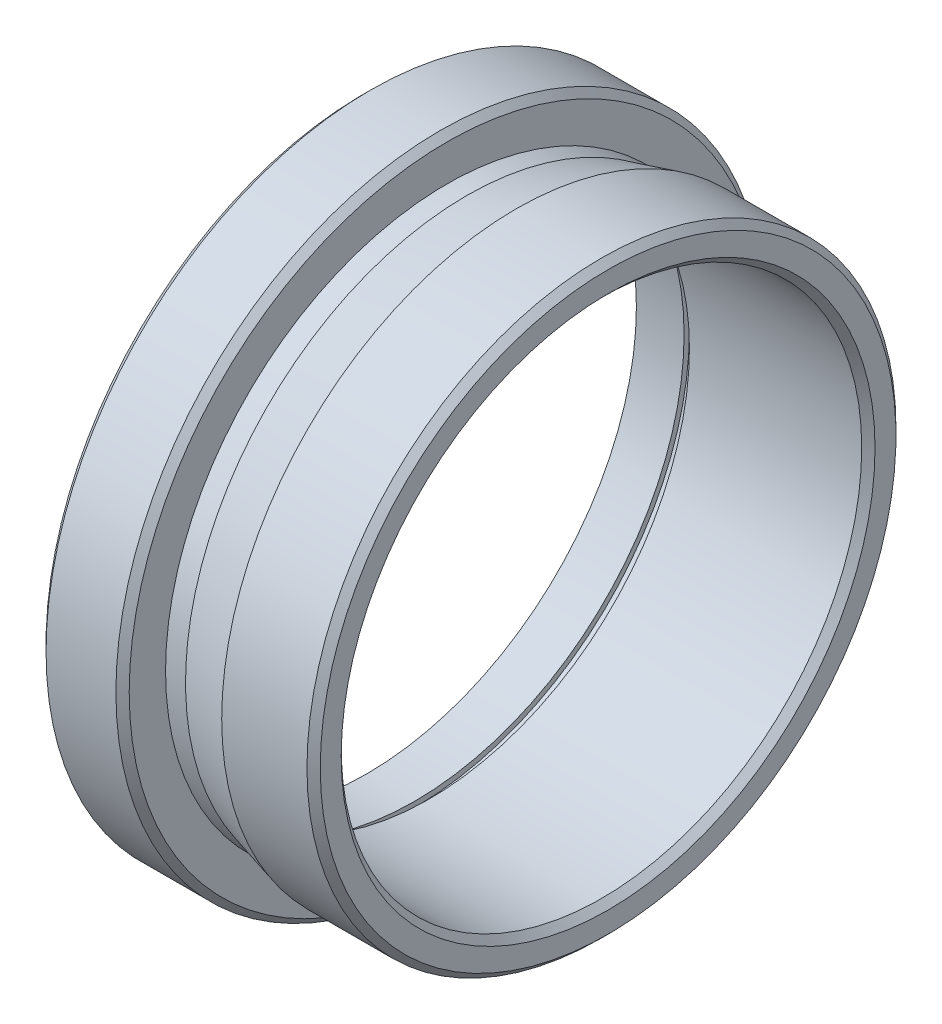
ISO-10303-21;
HEADER;
FILE_DESCRIPTION(('STEP AP214'),'2;1');
FILE_NAME('part.step','',(''),(''),'','','');
FILE_SCHEMA(('AUTOMOTIVE_DESIGN { 1 0 10303 214 1 1 1 1 }'));
ENDSEC;
DATA;
#1=APPLICATION_CONTEXT('core data for automotive mechanical design processes');
#2=APPLICATION_PROTOCOL_DEFINITION('international standard','automotive_design',2000,#1);
#3=PRODUCT_CONTEXT('',#1,'mechanical');
#4=PRODUCT('Part','Part','',(#3));
#5=PRODUCT_RELATED_PRODUCT_CATEGORY('part','',(#4));
#6=PRODUCT_DEFINITION_FORMATION('','',#4);
#7=PRODUCT_DEFINITION_CONTEXT('part definition',#1,'design');
#8=PRODUCT_DEFINITION('design','',#6,#7);
#9=PRODUCT_DEFINITION_SHAPE('','',#8);
#10=(LENGTH_UNIT() NAMED_UNIT(*) SI_UNIT(.MILLI.,.METRE.));
#11=(NAMED_UNIT(*) PLANE_ANGLE_UNIT() SI_UNIT($,.RADIAN.));
#12=(NAMED_UNIT(*) SI_UNIT($,.STERADIAN.) SOLID_ANGLE_UNIT());
#13=UNCERTAINTY_MEASURE_WITH_UNIT(LENGTH_MEASURE(1.E-05),#10,'distance_accuracy_value','');
#14=(GEOMETRIC_REPRESENTATION_CONTEXT(3) GLOBAL_UNCERTAINTY_ASSIGNED_CONTEXT((#13)) GLOBAL_UNIT_ASSIGNED_CONTEXT((#10,
#11,#12)) REPRESENTATION_CONTEXT('',''));
#15=CARTESIAN_POINT('',(0.,0.,0.));
#16=DIRECTION('',(0.,0.,1.));
#17=DIRECTION('',(1.,0.,0.));
#18=AXIS2_PLACEMENT_3D('',#15,#16,#17);
#19=CARTESIAN_POINT('',(-14.6609,0.,0.));
#20=DIRECTION('',(1.,0.,0.));
#21=DIRECTION('',(0.,0.,-1.));
#22=AXIS2_PLACEMENT_3D('',#19,#20,#21);
#23=CYLINDRICAL_SURFACE('',#22,24.765);
#24=CARTESIAN_POINT('',(-17.3279,0.,0.));
#25=DIRECTION('',(1.,0.,0.));
#26=DIRECTION('',(0.,-1.,0.));
#27=AXIS2_PLACEMENT_3D('',#24,#25,#26);
#28=CIRCLE('',#27,24.765);
#29=CARTESIAN_POINT('',(-17.3279,-24.765,0.));
#30=VERTEX_POINT('',#29);
#31=EDGE_CURVE('E46',#30,#30,#28,.F.);
#32=ORIENTED_EDGE('',*,*,#31,.F.);
#33=EDGE_LOOP('',(#32));
#34=FACE_BOUND('',#33,.T.);
#35=CARTESIAN_POINT('',(-11.9939,0.,0.));
#36=DIRECTION('',(-1.,0.,0.));
#37=DIRECTION('',(0.,-1.,0.));
#38=AXIS2_PLACEMENT_3D('',#35,#36,#37);
#39=CIRCLE('',#38,24.765);
#40=CARTESIAN_POINT('',(-11.9939,-24.765,0.));
#41=VERTEX_POINT('',#40);
#42=EDGE_CURVE('E49',#41,#41,#39,.F.);
#43=ORIENTED_EDGE('',*,*,#42,.F.);
#44=EDGE_LOOP('',(#43));
#45=FACE_BOUND('',#44,.T.);
#46=ADVANCED_FACE('F14',(#34,#45),#23,.T.);
#47=CARTESIAN_POINT('',(-11.9939,0.,0.));
#48=DIRECTION('',(-1.,0.,0.));
#49=DIRECTION('',(0.,0.,1.));
#50=AXIS2_PLACEMENT_3D('',#47,#48,#49);
#51=CONICAL_SURFACE('',#50,24.765,0.785398163397447);
#52=ORIENTED_EDGE('',*,*,#42,.T.);
#53=EDGE_LOOP('',(#52));
#54=FACE_BOUND('',#53,.T.);
#55=CARTESIAN_POINT('',(-11.4859,0.,0.));
#56=DIRECTION('',(-1.,0.,0.));
#57=DIRECTION('',(0.,0.,1.));
#58=AXIS2_PLACEMENT_3D('',#55,#56,#57);
#59=CIRCLE('',#58,24.257);
#60=CARTESIAN_POINT('',(-11.4859,0.,24.257));
#61=VERTEX_POINT('',#60);
#62=EDGE_CURVE('E17',#61,#61,#59,.F.);
#63=ORIENTED_EDGE('',*,*,#62,.F.);
#64=EDGE_LOOP('',(#63));
#65=FACE_BOUND('',#64,.T.);
#66=ADVANCED_FACE('F77',(#54,#65),#51,.T.);
#67=CARTESIAN_POINT('',(-17.3279,0.,0.));
#68=DIRECTION('',(1.,0.,0.));
#69=DIRECTION('',(0.,0.,-1.));
#70=AXIS2_PLACEMENT_3D('',#67,#68,#69);
#71=CONICAL_SURFACE('',#70,24.765,0.785398163397448);
#72=CARTESIAN_POINT('',(-17.8359,0.,0.));
#73=DIRECTION('',(1.,0.,0.));
#74=DIRECTION('',(0.,0.,-1.));
#75=AXIS2_PLACEMENT_3D('',#72,#73,#74);
#76=CIRCLE('',#75,24.257);
#77=CARTESIAN_POINT('',(-17.8359,0.,-24.257));
#78=VERTEX_POINT('',#77);
#79=EDGE_CURVE('E68',#78,#78,#76,.F.);
#80=ORIENTED_EDGE('',*,*,#79,.F.);
#81=EDGE_LOOP('',(#80));
#82=FACE_BOUND('',#81,.T.);
#83=ORIENTED_EDGE('',*,*,#31,.T.);
#84=EDGE_LOOP('',(#83));
#85=FACE_BOUND('',#84,.T.);
#86=ADVANCED_FACE('F79',(#82,#85),#71,.T.);
#87=CARTESIAN_POINT('',(-11.4859,21.4799238493801,0.));
#88=DIRECTION('',(1.,0.,0.));
#89=DIRECTION('',(0.,0.,-1.));
#90=AXIS2_PLACEMENT_3D('',#87,#88,#89);
#91=PLANE('',#90);
#92=CARTESIAN_POINT('',(-11.4859,0.,0.));
#93=DIRECTION('',(1.,0.,0.));
#94=DIRECTION('',(0.,0.,-1.));
#95=AXIS2_PLACEMENT_3D('',#92,#93,#94);
#96=CIRCLE('',#95,21.4799238493801);
#97=CARTESIAN_POINT('',(-11.4859,0.,-21.4799238493801));
#98=VERTEX_POINT('',#97);
#99=EDGE_CURVE('E66',#98,#98,#96,.T.);
#100=ORIENTED_EDGE('',*,*,#99,.F.);
#101=EDGE_LOOP('',(#100));
#102=FACE_BOUND('',#101,.T.);
#103=ORIENTED_EDGE('',*,*,#62,.T.);
#104=EDGE_LOOP('',(#103));
#105=FACE_BOUND('',#104,.T.);
#106=ADVANCED_FACE('F75',(#102,#105),#91,.T.);
#107=CARTESIAN_POINT('',(-17.8359,24.765,0.));
#108=DIRECTION('',(-1.,0.,0.));
#109=DIRECTION('',(0.,0.,1.));
#110=AXIS2_PLACEMENT_3D('',#107,#108,#109);
#111=PLANE('',#110);
#112=CARTESIAN_POINT('',(-17.8359,0.,0.));
#113=DIRECTION('',(-1.,0.,0.));
#114=DIRECTION('',(0.,0.,1.));
#115=AXIS2_PLACEMENT_3D('',#112,#113,#114);
#116=CIRCLE('',#115,21.0004);
#117=CARTESIAN_POINT('',(-17.8359,0.,21.0004));
#118=VERTEX_POINT('',#117);
#119=EDGE_CURVE('E45',#118,#118,#116,.F.);
#120=ORIENTED_EDGE('',*,*,#119,.T.);
#121=EDGE_LOOP('',(#120));
#122=FACE_BOUND('',#121,.T.);
#123=ORIENTED_EDGE('',*,*,#79,.T.);
#124=EDGE_LOOP('',(#123));
#125=FACE_BOUND('',#124,.T.);
#126=ADVANCED_FACE('F141',(#122,#125),#111,.T.);
#127=CARTESIAN_POINT('',(-10.7239,0.,0.));
#128=DIRECTION('',(1.,0.,0.));
#129=DIRECTION('',(0.,0.,-1.));
#130=AXIS2_PLACEMENT_3D('',#127,#128,#129);
#131=CYLINDRICAL_SURFACE('',#130,21.4799238493801);
#132=ORIENTED_EDGE('',*,*,#99,.T.);
#133=EDGE_LOOP('',(#132));
#134=FACE_BOUND('',#133,.T.);
#135=CARTESIAN_POINT('',(-9.96190000000001,0.,0.));
#136=DIRECTION('',(1.,0.,0.));
#137=DIRECTION('',(0.,1.,0.));
#138=AXIS2_PLACEMENT_3D('',#135,#136,#137);
#139=CIRCLE('',#138,21.4799238493801);
#140=CARTESIAN_POINT('',(-9.96190000000001,21.4799238493801,0.));
#141=VERTEX_POINT('',#140);
#142=EDGE_CURVE('E42',#141,#141,#139,.T.);
#143=ORIENTED_EDGE('',*,*,#142,.F.);
#144=EDGE_LOOP('',(#143));
#145=FACE_BOUND('',#144,.T.);
#146=ADVANCED_FACE('F137',(#134,#145),#131,.T.);
#147=CARTESIAN_POINT('',(-17.8359,0.,0.));
#148=DIRECTION('',(-1.,0.,0.));
#149=DIRECTION('',(0.,0.,1.));
#150=AXIS2_PLACEMENT_3D('',#147,#148,#149);
#151=CONICAL_SURFACE('',#150,21.0004,1.0471975511966);
#152=ORIENTED_EDGE('',*,*,#119,.F.);
#153=EDGE_LOOP('',(#152));
#154=FACE_BOUND('',#153,.T.);
#155=CARTESIAN_POINT('',(-17.6012648506013,0.,0.));
#156=DIRECTION('',(1.,0.,0.));
#157=DIRECTION('',(0.,0.,-1.));
#158=AXIS2_PLACEMENT_3D('',#155,#156,#157);
#159=CIRCLE('',#158,20.594);
#160=CARTESIAN_POINT('',(-17.6012648506013,0.,-20.594));
#161=VERTEX_POINT('',#160);
#162=EDGE_CURVE('E35',#161,#161,#159,.T.);
#163=ORIENTED_EDGE('',*,*,#162,.T.);
#164=EDGE_LOOP('',(#163));
#165=FACE_BOUND('',#164,.T.);
#166=ADVANCED_FACE('F133',(#154,#165),#151,.F.);
#167=CARTESIAN_POINT('',(-6.18589999999999,0.,0.));
#168=DIRECTION('',(1.,0.,0.));
#169=DIRECTION('',(0.,0.,-1.));
#170=AXIS2_PLACEMENT_3D('',#167,#168,#169);
#171=CONICAL_SURFACE('',#170,22.4917,0.26179938779915);
#172=ORIENTED_EDGE('',*,*,#142,.T.);
#173=EDGE_LOOP('',(#172));
#174=FACE_BOUND('',#173,.T.);
#175=CARTESIAN_POINT('',(-6.1859,0.,0.));
#176=DIRECTION('',(1.,0.,0.));
#177=DIRECTION('',(0.,0.,-1.));
#178=AXIS2_PLACEMENT_3D('',#175,#176,#177);
#179=CIRCLE('',#178,22.4917);
#180=CARTESIAN_POINT('',(-6.1859,0.,-22.4917));
#181=VERTEX_POINT('',#180);
#182=EDGE_CURVE('E31',#181,#181,#179,.T.);
#183=ORIENTED_EDGE('',*,*,#182,.F.);
#184=EDGE_LOOP('',(#183));
#185=FACE_BOUND('',#184,.T.);
#186=ADVANCED_FACE('F129',(#174,#185),#171,.T.);
#187=CARTESIAN_POINT('',(-15.7792924253007,0.,0.));
#188=DIRECTION('',(1.,0.,0.));
#189=DIRECTION('',(0.,0.,-1.));
#190=AXIS2_PLACEMENT_3D('',#187,#188,#189);
#191=CYLINDRICAL_SURFACE('',#190,20.594);
#192=ORIENTED_EDGE('',*,*,#162,.F.);
#193=EDGE_LOOP('',(#192));
#194=FACE_BOUND('',#193,.T.);
#195=CARTESIAN_POINT('',(-13.95732,0.,0.));
#196=DIRECTION('',(1.,0.,0.));
#197=DIRECTION('',(0.,0.,-1.));
#198=AXIS2_PLACEMENT_3D('',#195,#196,#197);
#199=CIRCLE('',#198,20.594);
#200=CARTESIAN_POINT('',(-13.95732,0.,-20.594));
#201=VERTEX_POINT('',#200);
#202=EDGE_CURVE('E34',#201,#201,#199,.F.);
#203=ORIENTED_EDGE('',*,*,#202,.F.);
#204=EDGE_LOOP('',(#203));
#205=FACE_BOUND('',#204,.T.);
#206=ADVANCED_FACE('F125',(#194,#205),#191,.F.);
#207=CARTESIAN_POINT('',(-2.67640000000001,0.,0.));
#208=DIRECTION('',(1.,0.,0.));
#209=DIRECTION('',(0.,0.,-1.));
#210=AXIS2_PLACEMENT_3D('',#207,#208,#209);
#211=CYLINDRICAL_SURFACE('',#210,22.4917);
#212=ORIENTED_EDGE('',*,*,#182,.T.);
#213=EDGE_LOOP('',(#212));
#214=FACE_BOUND('',#213,.T.);
#215=CARTESIAN_POINT('',(0.325100000000002,0.,0.));
#216=DIRECTION('',(-1.,0.,0.));
#217=DIRECTION('',(0.,-1.,0.));
#218=AXIS2_PLACEMENT_3D('',#215,#216,#217);
#219=CIRCLE('',#218,22.4917);
#220=CARTESIAN_POINT('',(0.325100000000001,-22.4917,0.));
#221=VERTEX_POINT('',#220);
#222=EDGE_CURVE('E36',#221,#221,#219,.F.);
#223=ORIENTED_EDGE('',*,*,#222,.F.);
#224=EDGE_LOOP('',(#223));
#225=FACE_BOUND('',#224,.T.);
#226=ADVANCED_FACE('F121',(#214,#225),#211,.T.);
#227=CARTESIAN_POINT('',(-13.95732,20.594,0.));
#228=DIRECTION('',(1.,0.,0.));
#229=DIRECTION('',(0.,0.,-1.));
#230=AXIS2_PLACEMENT_3D('',#227,#228,#229);
#231=PLANE('',#230);
#232=ORIENTED_EDGE('',*,*,#202,.T.);
#233=EDGE_LOOP('',(#232));
#234=FACE_BOUND('',#233,.T.);
#235=CARTESIAN_POINT('',(-13.95732,0.,0.));
#236=DIRECTION('',(1.,0.,0.));
#237=DIRECTION('',(0.,0.,-1.));
#238=AXIS2_PLACEMENT_3D('',#235,#236,#237);
#239=CIRCLE('',#238,21.0004);
#240=CARTESIAN_POINT('',(-13.95732,0.,-21.0004));
#241=VERTEX_POINT('',#240);
#242=EDGE_CURVE('E39',#241,#241,#239,.T.);
#243=ORIENTED_EDGE('',*,*,#242,.T.);
#244=EDGE_LOOP('',(#243));
#245=FACE_BOUND('',#244,.T.);
#246=ADVANCED_FACE('F117',(#234,#245),#231,.T.);
#247=CARTESIAN_POINT('',(0.325100000000001,0.,0.));
#248=DIRECTION('',(-1.,0.,0.));
#249=DIRECTION('',(0.,0.,1.));
#250=AXIS2_PLACEMENT_3D('',#247,#248,#249);
#251=CONICAL_SURFACE('',#250,22.4917,0.785398163397426);
#252=ORIENTED_EDGE('',*,*,#222,.T.);
#253=EDGE_LOOP('',(#252));
#254=FACE_BOUND('',#253,.T.);
#255=CARTESIAN_POINT('',(0.833100000000003,0.,0.));
#256=DIRECTION('',(-1.,0.,0.));
#257=DIRECTION('',(0.,0.,1.));
#258=AXIS2_PLACEMENT_3D('',#255,#256,#257);
#259=CIRCLE('',#258,21.9837);
#260=CARTESIAN_POINT('',(0.833100000000003,0.,21.9837));
#261=VERTEX_POINT('',#260);
#262=EDGE_CURVE('E57',#261,#261,#259,.F.);
#263=ORIENTED_EDGE('',*,*,#262,.F.);
#264=EDGE_LOOP('',(#263));
#265=FACE_BOUND('',#264,.T.);
#266=ADVANCED_FACE('F113',(#254,#265),#251,.T.);
#267=CARTESIAN_POINT('',(-13.39471,0.,0.));
#268=DIRECTION('',(1.,0.,0.));
#269=DIRECTION('',(0.,0.,-1.));
#270=AXIS2_PLACEMENT_3D('',#267,#268,#269);
#271=CYLINDRICAL_SURFACE('',#270,21.0004);
#272=ORIENTED_EDGE('',*,*,#242,.F.);
#273=EDGE_LOOP('',(#272));
#274=FACE_BOUND('',#273,.T.);
#275=CARTESIAN_POINT('',(-12.8321,0.,0.));
#276=DIRECTION('',(1.,0.,0.));
#277=DIRECTION('',(0.,0.,-1.));
#278=AXIS2_PLACEMENT_3D('',#275,#276,#277);
#279=CIRCLE('',#278,21.0004);
#280=CARTESIAN_POINT('',(-12.8321,0.,-21.0004));
#281=VERTEX_POINT('',#280);
#282=EDGE_CURVE('E54',#281,#281,#279,.F.);
#283=ORIENTED_EDGE('',*,*,#282,.F.);
#284=EDGE_LOOP('',(#283));
#285=FACE_BOUND('',#284,.T.);
#286=ADVANCED_FACE('F109',(#274,#285),#271,.F.);
#287=CARTESIAN_POINT('',(0.833099999999998,19.877,0.));
#288=DIRECTION('',(1.,0.,0.));
#289=DIRECTION('',(0.,0.,-1.));
#290=AXIS2_PLACEMENT_3D('',#287,#288,#289);
#291=PLANE('',#290);
#292=CARTESIAN_POINT('',(0.833099999999998,0.,0.));
#293=DIRECTION('',(1.,0.,0.));
#294=DIRECTION('',(0.,0.,-1.));
#295=AXIS2_PLACEMENT_3D('',#292,#293,#294);
#296=CIRCLE('',#295,20.385);
#297=CARTESIAN_POINT('',(0.833099999999998,0.,-20.385));
#298=VERTEX_POINT('',#297);
#299=EDGE_CURVE('E26',#298,#298,#296,.F.);
#300=ORIENTED_EDGE('',*,*,#299,.T.);
#301=EDGE_LOOP('',(#300));
#302=FACE_BOUND('',#301,.T.);
#303=ORIENTED_EDGE('',*,*,#262,.T.);
#304=EDGE_LOOP('',(#303));
#305=FACE_BOUND('',#304,.T.);
#306=ADVANCED_FACE('F105',(#302,#305),#291,.T.);
#307=CARTESIAN_POINT('',(-12.8321,21.0004,0.));
#308=DIRECTION('',(-1.,0.,0.));
#309=DIRECTION('',(0.,0.,1.));
#310=AXIS2_PLACEMENT_3D('',#307,#308,#309);
#311=PLANE('',#310);
#312=CARTESIAN_POINT('',(-12.8321,0.,0.));
#313=DIRECTION('',(1.,0.,0.));
#314=DIRECTION('',(0.,0.,-1.));
#315=AXIS2_PLACEMENT_3D('',#312,#313,#314);
#316=CIRCLE('',#315,19.877);
#317=CARTESIAN_POINT('',(-12.8321,0.,-19.877));
#318=VERTEX_POINT('',#317);
#319=EDGE_CURVE('E21',#318,#318,#316,.T.);
#320=ORIENTED_EDGE('',*,*,#319,.T.);
#321=EDGE_LOOP('',(#320));
#322=FACE_BOUND('',#321,.T.);
#323=ORIENTED_EDGE('',*,*,#282,.T.);
#324=EDGE_LOOP('',(#323));
#325=FACE_BOUND('',#324,.T.);
#326=ADVANCED_FACE('F97',(#322,#325),#311,.T.);
#327=CARTESIAN_POINT('',(0.833099999999998,0.,0.));
#328=DIRECTION('',(1.,0.,0.));
#329=DIRECTION('',(0.,0.,-1.));
#330=AXIS2_PLACEMENT_3D('',#327,#328,#329);
#331=CONICAL_SURFACE('',#330,20.385,0.78539816339745);
#332=ORIENTED_EDGE('',*,*,#299,.F.);
#333=EDGE_LOOP('',(#332));
#334=FACE_BOUND('',#333,.T.);
#335=CARTESIAN_POINT('',(0.325099999999997,0.,0.));
#336=DIRECTION('',(1.,0.,0.));
#337=DIRECTION('',(0.,0.,-1.));
#338=AXIS2_PLACEMENT_3D('',#335,#336,#337);
#339=CIRCLE('',#338,19.877);
#340=CARTESIAN_POINT('',(0.325099999999997,0.,-19.877));
#341=VERTEX_POINT('',#340);
#342=EDGE_CURVE('E10',#341,#341,#339,.F.);
#343=ORIENTED_EDGE('',*,*,#342,.T.);
#344=EDGE_LOOP('',(#343));
#345=FACE_BOUND('',#344,.T.);
#346=ADVANCED_FACE('F91',(#334,#345),#331,.F.);
#347=CARTESIAN_POINT('',(-5.9995,0.,0.));
#348=DIRECTION('',(1.,0.,0.));
#349=DIRECTION('',(0.,0.,-1.));
#350=AXIS2_PLACEMENT_3D('',#347,#348,#349);
#351=CYLINDRICAL_SURFACE('',#350,19.877);
#352=ORIENTED_EDGE('',*,*,#319,.F.);
#353=EDGE_LOOP('',(#352));
#354=FACE_BOUND('',#353,.T.);
#355=ORIENTED_EDGE('',*,*,#342,.F.);
#356=EDGE_LOOP('',(#355));
#357=FACE_BOUND('',#356,.T.);
#358=ADVANCED_FACE('F89',(#354,#357),#351,.F.);
#359=CLOSED_SHELL('',(#46,#66,#86,#106,#126,#146,#166,#186,#206,#226,#246,#266,#286,#306,#326,
#346,#358));
#360=MANIFOLD_SOLID_BREP('B1',#359);
#361=ADVANCED_BREP_SHAPE_REPRESENTATION('',(#18,#360),#14);
#362=SHAPE_DEFINITION_REPRESENTATION(#9,#361);
ENDSEC;
END-ISO-10303-21;
